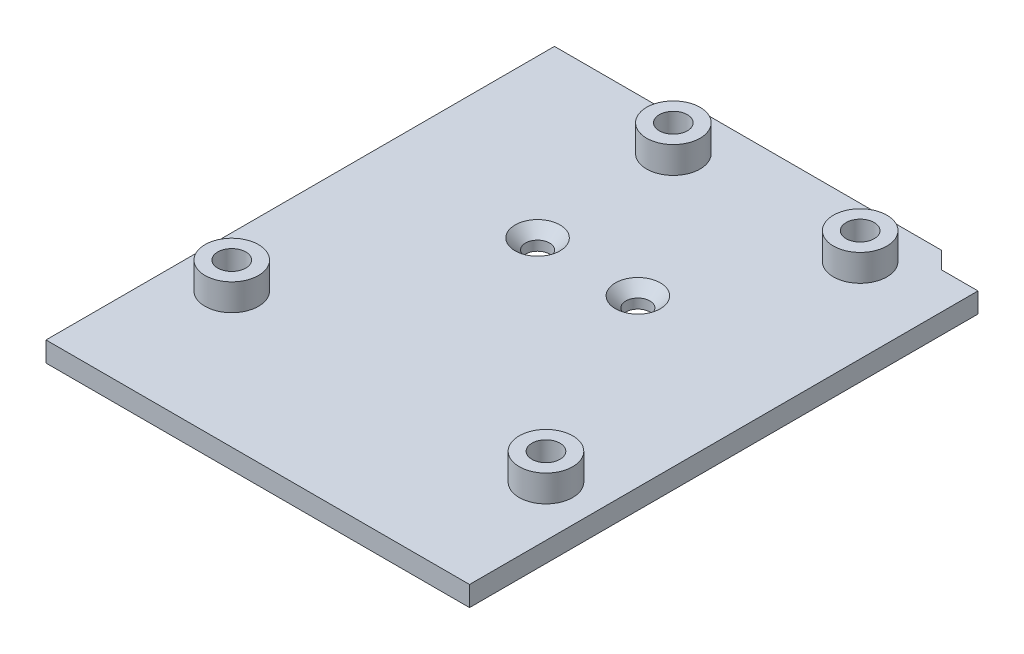
ISO-10303-21;
HEADER;
FILE_DESCRIPTION(('STEP AP214'),'2;1');
FILE_NAME('part.step','',(''),(''),'','','');
FILE_SCHEMA(('AUTOMOTIVE_DESIGN { 1 0 10303 214 1 1 1 1 }'));
ENDSEC;
DATA;
#1=APPLICATION_CONTEXT('core data for automotive mechanical design processes');
#2=APPLICATION_PROTOCOL_DEFINITION('international standard','automotive_design',2000,#1);
#3=PRODUCT_CONTEXT('',#1,'mechanical');
#4=PRODUCT('Part','Part','',(#3));
#5=PRODUCT_RELATED_PRODUCT_CATEGORY('part','',(#4));
#6=PRODUCT_DEFINITION_FORMATION('','',#4);
#7=PRODUCT_DEFINITION_CONTEXT('part definition',#1,'design');
#8=PRODUCT_DEFINITION('design','',#6,#7);
#9=PRODUCT_DEFINITION_SHAPE('','',#8);
#10=(LENGTH_UNIT() NAMED_UNIT(*) SI_UNIT(.MILLI.,.METRE.));
#11=(NAMED_UNIT(*) PLANE_ANGLE_UNIT() SI_UNIT($,.RADIAN.));
#12=(NAMED_UNIT(*) SI_UNIT($,.STERADIAN.) SOLID_ANGLE_UNIT());
#13=UNCERTAINTY_MEASURE_WITH_UNIT(LENGTH_MEASURE(1.E-05),#10,'distance_accuracy_value','');
#14=(GEOMETRIC_REPRESENTATION_CONTEXT(3) GLOBAL_UNCERTAINTY_ASSIGNED_CONTEXT((#13)) GLOBAL_UNIT_ASSIGNED_CONTEXT((#10,
#11,#12)) REPRESENTATION_CONTEXT('',''));
#15=CARTESIAN_POINT('',(0.,0.,0.));
#16=DIRECTION('',(0.,0.,1.));
#17=DIRECTION('',(1.,0.,0.));
#18=AXIS2_PLACEMENT_3D('',#15,#16,#17);
#19=CARTESIAN_POINT('',(0.,3.,0.));
#20=DIRECTION('',(0.,1.,0.));
#21=DIRECTION('',(0.,0.,1.));
#22=AXIS2_PLACEMENT_3D('',#19,#20,#21);
#23=PLANE('',#22);
#24=CARTESIAN_POINT('',(-34.7977808411741,3.,-44.9735412165921));
#25=DIRECTION('',(0.,1.,0.));
#26=DIRECTION('',(0.,0.,1.));
#27=AXIS2_PLACEMENT_3D('',#24,#25,#26);
#28=CIRCLE('',#27,3.36);
#29=CARTESIAN_POINT('',(-34.7977808411741,3.,-41.6135412165921));
#30=VERTEX_POINT('',#29);
#31=EDGE_CURVE('E328',#30,#30,#28,.T.);
#32=ORIENTED_EDGE('',*,*,#31,.F.);
#33=EDGE_LOOP('',(#32));
#34=FACE_BOUND('',#33,.T.);
#35=CARTESIAN_POINT('',(-19.7977808411741,3.,-44.9735412165921));
#36=DIRECTION('',(0.,1.,0.));
#37=DIRECTION('',(0.,0.,1.));
#38=AXIS2_PLACEMENT_3D('',#35,#36,#37);
#39=CIRCLE('',#38,3.36);
#40=CARTESIAN_POINT('',(-19.7977808411741,3.,-41.6135412165921));
#41=VERTEX_POINT('',#40);
#42=EDGE_CURVE('E168',#41,#41,#39,.T.);
#43=ORIENTED_EDGE('',*,*,#42,.F.);
#44=EDGE_LOOP('',(#43));
#45=FACE_BOUND('',#44,.T.);
#46=CARTESIAN_POINT('',(-7.62,3.,-66.04));
#47=DIRECTION('',(0.,1.,0.));
#48=DIRECTION('',(0.,0.,1.));
#49=AXIS2_PLACEMENT_3D('',#46,#47,#48);
#50=CIRCLE('',#49,4.);
#51=CARTESIAN_POINT('',(-7.62,3.,-62.04));
#52=VERTEX_POINT('',#51);
#53=EDGE_CURVE('E184',#52,#52,#50,.T.);
#54=ORIENTED_EDGE('',*,*,#53,.F.);
#55=EDGE_LOOP('',(#54));
#56=FACE_BOUND('',#55,.T.);
#57=CARTESIAN_POINT('',(-50.8,3.,-15.24));
#58=DIRECTION('',(0.,1.,0.));
#59=DIRECTION('',(0.,0.,1.));
#60=AXIS2_PLACEMENT_3D('',#57,#58,#59);
#61=CIRCLE('',#60,4.00000000000001);
#62=CARTESIAN_POINT('',(-50.8,3.,-11.24));
#63=VERTEX_POINT('',#62);
#64=EDGE_CURVE('E202',#63,#63,#61,.T.);
#65=ORIENTED_EDGE('',*,*,#64,.F.);
#66=EDGE_LOOP('',(#65));
#67=FACE_BOUND('',#66,.T.);
#68=DIRECTION('',(1.,0.,0.));
#69=VECTOR('',#68,1.);
#70=CARTESIAN_POINT('',(-58.34,3.,5.00000000000001));
#71=LINE('',#70,#69);
#72=CARTESIAN_POINT('',(-58.34,3.,5.00000000000001));
#73=VERTEX_POINT('',#72);
#74=CARTESIAN_POINT('',(5.,3.,5.00000000000001));
#75=VERTEX_POINT('',#74);
#76=EDGE_CURVE('E147',#73,#75,#71,.T.);
#77=ORIENTED_EDGE('',*,*,#76,.T.);
#78=DIRECTION('',(0.,0.,-1.));
#79=VECTOR('',#78,1.);
#80=CARTESIAN_POINT('',(5.,3.,5.00000000000001));
#81=LINE('',#80,#79);
#82=CARTESIAN_POINT('',(5.,3.,-71.04));
#83=VERTEX_POINT('',#82);
#84=EDGE_CURVE('E95',#75,#83,#81,.T.);
#85=ORIENTED_EDGE('',*,*,#84,.T.);
#86=DIRECTION('',(-1.,0.,0.));
#87=VECTOR('',#86,1.);
#88=CARTESIAN_POINT('',(5.,3.,-71.04));
#89=LINE('',#88,#87);
#90=CARTESIAN_POINT('',(-0.468932188134528,3.,-71.04));
#91=VERTEX_POINT('',#90);
#92=EDGE_CURVE('E221',#83,#91,#89,.T.);
#93=ORIENTED_EDGE('',*,*,#92,.T.);
#94=DIRECTION('',(-0.707106781186548,0.,-0.707106781186547));
#95=VECTOR('',#94,1.);
#96=CARTESIAN_POINT('',(-0.468932188134528,3.,-71.04));
#97=LINE('',#96,#95);
#98=CARTESIAN_POINT('',(-3.00893218813453,3.,-73.58));
#99=VERTEX_POINT('',#98);
#100=EDGE_CURVE('E223',#91,#99,#97,.T.);
#101=ORIENTED_EDGE('',*,*,#100,.T.);
#102=DIRECTION('',(-1.,0.,0.));
#103=VECTOR('',#102,1.);
#104=CARTESIAN_POINT('',(-3.00893218813453,3.,-73.58));
#105=LINE('',#104,#103);
#106=CARTESIAN_POINT('',(-39.9170678118655,3.,-73.58));
#107=VERTEX_POINT('',#106);
#108=EDGE_CURVE('E114',#99,#107,#105,.T.);
#109=ORIENTED_EDGE('',*,*,#108,.T.);
#110=DIRECTION('',(-0.707106781186548,0.,0.707106781186548));
#111=VECTOR('',#110,1.);
#112=CARTESIAN_POINT('',(-39.9170678118655,3.,-73.58));
#113=LINE('',#112,#111);
#114=CARTESIAN_POINT('',(-42.4570678118655,3.,-71.04));
#115=VERTEX_POINT('',#114);
#116=EDGE_CURVE('E108',#107,#115,#113,.T.);
#117=ORIENTED_EDGE('',*,*,#116,.T.);
#118=DIRECTION('',(-1.,0.,0.));
#119=VECTOR('',#118,1.);
#120=CARTESIAN_POINT('',(-42.4570678118655,3.,-71.04));
#121=LINE('',#120,#119);
#122=CARTESIAN_POINT('',(-58.34,3.,-71.04));
#123=VERTEX_POINT('',#122);
#124=EDGE_CURVE('E112',#115,#123,#121,.T.);
#125=ORIENTED_EDGE('',*,*,#124,.T.);
#126=DIRECTION('',(0.,0.,1.));
#127=VECTOR('',#126,1.);
#128=CARTESIAN_POINT('',(-58.34,3.,-71.04));
#129=LINE('',#128,#127);
#130=EDGE_CURVE('E52',#123,#73,#129,.T.);
#131=ORIENTED_EDGE('',*,*,#130,.T.);
#132=EDGE_LOOP('',(#77,#85,#93,#101,#109,#117,#125,#131));
#133=FACE_BOUND('',#132,.T.);
#134=CARTESIAN_POINT('',(-35.56,3.,-66.04));
#135=DIRECTION('',(0.,1.,0.));
#136=DIRECTION('',(0.,0.,1.));
#137=AXIS2_PLACEMENT_3D('',#134,#135,#136);
#138=CIRCLE('',#137,4.);
#139=CARTESIAN_POINT('',(-35.56,3.,-62.04));
#140=VERTEX_POINT('',#139);
#141=EDGE_CURVE('E193',#140,#140,#138,.T.);
#142=ORIENTED_EDGE('',*,*,#141,.F.);
#143=EDGE_LOOP('',(#142));
#144=FACE_BOUND('',#143,.T.);
#145=CARTESIAN_POINT('',(-2.54,3.,-13.97));
#146=DIRECTION('',(0.,1.,0.));
#147=DIRECTION('',(0.,0.,1.));
#148=AXIS2_PLACEMENT_3D('',#145,#146,#147);
#149=CIRCLE('',#148,4.);
#150=CARTESIAN_POINT('',(-2.54,3.,-9.97));
#151=VERTEX_POINT('',#150);
#152=EDGE_CURVE('E165',#151,#151,#149,.T.);
#153=ORIENTED_EDGE('',*,*,#152,.F.);
#154=EDGE_LOOP('',(#153));
#155=FACE_BOUND('',#154,.T.);
#156=ADVANCED_FACE('F33',(#34,#45,#56,#67,#133,#144,#155),#23,.T.);
#157=CARTESIAN_POINT('',(0.,0.,0.));
#158=DIRECTION('',(0.,1.,0.));
#159=DIRECTION('',(0.,0.,1.));
#160=AXIS2_PLACEMENT_3D('',#157,#158,#159);
#161=PLANE('',#160);
#162=CARTESIAN_POINT('',(-34.7977808411741,0.,-44.9735412165921));
#163=DIRECTION('',(0.,1.,0.));
#164=DIRECTION('',(0.,0.,1.));
#165=AXIS2_PLACEMENT_3D('',#162,#163,#164);
#166=CIRCLE('',#165,1.79999999999999);
#167=CARTESIAN_POINT('',(-34.7977808411741,0.,-43.1735412165921));
#168=VERTEX_POINT('',#167);
#169=EDGE_CURVE('E37',#168,#168,#166,.T.);
#170=ORIENTED_EDGE('',*,*,#169,.T.);
#171=EDGE_LOOP('',(#170));
#172=FACE_BOUND('',#171,.T.);
#173=CARTESIAN_POINT('',(-19.7977808411741,0.,-44.9735412165921));
#174=DIRECTION('',(0.,1.,0.));
#175=DIRECTION('',(0.,0.,1.));
#176=AXIS2_PLACEMENT_3D('',#173,#174,#175);
#177=CIRCLE('',#176,1.79999999999999);
#178=CARTESIAN_POINT('',(-19.7977808411741,0.,-43.1735412165921));
#179=VERTEX_POINT('',#178);
#180=EDGE_CURVE('E158',#179,#179,#177,.T.);
#181=ORIENTED_EDGE('',*,*,#180,.T.);
#182=EDGE_LOOP('',(#181));
#183=FACE_BOUND('',#182,.T.);
#184=CARTESIAN_POINT('',(-50.8,0.,-15.24));
#185=DIRECTION('',(0.,1.,0.));
#186=DIRECTION('',(0.,0.,1.));
#187=AXIS2_PLACEMENT_3D('',#184,#185,#186);
#188=CIRCLE('',#187,2.1);
#189=CARTESIAN_POINT('',(-50.8,0.,-13.14));
#190=VERTEX_POINT('',#189);
#191=EDGE_CURVE('E136',#190,#190,#188,.T.);
#192=ORIENTED_EDGE('',*,*,#191,.T.);
#193=EDGE_LOOP('',(#192));
#194=FACE_BOUND('',#193,.T.);
#195=CARTESIAN_POINT('',(-35.56,0.,-66.04));
#196=DIRECTION('',(0.,1.,0.));
#197=DIRECTION('',(0.,0.,1.));
#198=AXIS2_PLACEMENT_3D('',#195,#196,#197);
#199=CIRCLE('',#198,2.1);
#200=CARTESIAN_POINT('',(-35.56,0.,-63.94));
#201=VERTEX_POINT('',#200);
#202=EDGE_CURVE('E211',#201,#201,#199,.T.);
#203=ORIENTED_EDGE('',*,*,#202,.T.);
#204=EDGE_LOOP('',(#203));
#205=FACE_BOUND('',#204,.T.);
#206=CARTESIAN_POINT('',(-7.62,0.,-66.04));
#207=DIRECTION('',(0.,1.,0.));
#208=DIRECTION('',(0.,0.,1.));
#209=AXIS2_PLACEMENT_3D('',#206,#207,#208);
#210=CIRCLE('',#209,2.1);
#211=CARTESIAN_POINT('',(-7.62,0.,-63.94));
#212=VERTEX_POINT('',#211);
#213=EDGE_CURVE('E214',#212,#212,#210,.T.);
#214=ORIENTED_EDGE('',*,*,#213,.T.);
#215=EDGE_LOOP('',(#214));
#216=FACE_BOUND('',#215,.T.);
#217=CARTESIAN_POINT('',(-2.54,0.,-13.97));
#218=DIRECTION('',(0.,1.,0.));
#219=DIRECTION('',(0.,0.,1.));
#220=AXIS2_PLACEMENT_3D('',#217,#218,#219);
#221=CIRCLE('',#220,2.1);
#222=CARTESIAN_POINT('',(-2.54,0.,-11.87));
#223=VERTEX_POINT('',#222);
#224=EDGE_CURVE('E206',#223,#223,#221,.T.);
#225=ORIENTED_EDGE('',*,*,#224,.T.);
#226=EDGE_LOOP('',(#225));
#227=FACE_BOUND('',#226,.T.);
#228=DIRECTION('',(1.,0.,0.));
#229=VECTOR('',#228,1.);
#230=CARTESIAN_POINT('',(-58.34,0.,5.00000000000001));
#231=LINE('',#230,#229);
#232=CARTESIAN_POINT('',(-58.34,0.,5.00000000000001));
#233=VERTEX_POINT('',#232);
#234=CARTESIAN_POINT('',(5.,0.,5.00000000000001));
#235=VERTEX_POINT('',#234);
#236=EDGE_CURVE('E132',#233,#235,#231,.T.);
#237=ORIENTED_EDGE('',*,*,#236,.F.);
#238=DIRECTION('',(0.,0.,1.));
#239=VECTOR('',#238,1.);
#240=CARTESIAN_POINT('',(-58.34,0.,-71.04));
#241=LINE('',#240,#239);
#242=CARTESIAN_POINT('',(-58.34,0.,-71.04));
#243=VERTEX_POINT('',#242);
#244=EDGE_CURVE('E87',#243,#233,#241,.T.);
#245=ORIENTED_EDGE('',*,*,#244,.F.);
#246=DIRECTION('',(-1.,0.,0.));
#247=VECTOR('',#246,1.);
#248=CARTESIAN_POINT('',(-42.4570678118655,0.,-71.04));
#249=LINE('',#248,#247);
#250=CARTESIAN_POINT('',(-42.4570678118655,0.,-71.04));
#251=VERTEX_POINT('',#250);
#252=EDGE_CURVE('E81',#251,#243,#249,.T.);
#253=ORIENTED_EDGE('',*,*,#252,.F.);
#254=DIRECTION('',(-0.707106781186548,0.,0.707106781186548));
#255=VECTOR('',#254,1.);
#256=CARTESIAN_POINT('',(-39.9170678118655,0.,-73.58));
#257=LINE('',#256,#255);
#258=CARTESIAN_POINT('',(-39.9170678118655,0.,-73.58));
#259=VERTEX_POINT('',#258);
#260=EDGE_CURVE('E122',#259,#251,#257,.T.);
#261=ORIENTED_EDGE('',*,*,#260,.F.);
#262=DIRECTION('',(-1.,0.,0.));
#263=VECTOR('',#262,1.);
#264=CARTESIAN_POINT('',(-3.00893218813453,0.,-73.58));
#265=LINE('',#264,#263);
#266=CARTESIAN_POINT('',(-3.00893218813453,0.,-73.58));
#267=VERTEX_POINT('',#266);
#268=EDGE_CURVE('E142',#267,#259,#265,.T.);
#269=ORIENTED_EDGE('',*,*,#268,.F.);
#270=DIRECTION('',(-0.707106781186548,0.,-0.707106781186547));
#271=VECTOR('',#270,1.);
#272=CARTESIAN_POINT('',(-0.468932188134528,0.,-71.04));
#273=LINE('',#272,#271);
#274=CARTESIAN_POINT('',(-0.468932188134528,0.,-71.04));
#275=VERTEX_POINT('',#274);
#276=EDGE_CURVE('E140',#275,#267,#273,.T.);
#277=ORIENTED_EDGE('',*,*,#276,.F.);
#278=DIRECTION('',(-1.,0.,0.));
#279=VECTOR('',#278,1.);
#280=CARTESIAN_POINT('',(5.,0.,-71.04));
#281=LINE('',#280,#279);
#282=CARTESIAN_POINT('',(5.,0.,-71.04));
#283=VERTEX_POINT('',#282);
#284=EDGE_CURVE('E138',#283,#275,#281,.T.);
#285=ORIENTED_EDGE('',*,*,#284,.F.);
#286=DIRECTION('',(0.,0.,-1.));
#287=VECTOR('',#286,1.);
#288=CARTESIAN_POINT('',(5.,0.,5.00000000000001));
#289=LINE('',#288,#287);
#290=EDGE_CURVE('E135',#235,#283,#289,.T.);
#291=ORIENTED_EDGE('',*,*,#290,.F.);
#292=EDGE_LOOP('',(#237,#245,#253,#261,#269,#277,#285,#291));
#293=FACE_BOUND('',#292,.T.);
#294=ADVANCED_FACE('F236',(#172,#183,#194,#205,#216,#227,#293),#161,.F.);
#295=CARTESIAN_POINT('',(-58.34,3.,5.00000000000001));
#296=DIRECTION('',(0.,0.,-1.));
#297=DIRECTION('',(-1.,0.,0.));
#298=AXIS2_PLACEMENT_3D('',#295,#296,#297);
#299=PLANE('',#298);
#300=ORIENTED_EDGE('',*,*,#236,.T.);
#301=DIRECTION('',(0.,-1.,0.));
#302=VECTOR('',#301,1.);
#303=CARTESIAN_POINT('',(5.,3.,5.00000000000001));
#304=LINE('',#303,#302);
#305=EDGE_CURVE('E11',#75,#235,#304,.T.);
#306=ORIENTED_EDGE('',*,*,#305,.F.);
#307=ORIENTED_EDGE('',*,*,#76,.F.);
#308=DIRECTION('',(0.,-1.,0.));
#309=VECTOR('',#308,1.);
#310=CARTESIAN_POINT('',(-58.34,3.,5.00000000000001));
#311=LINE('',#310,#309);
#312=EDGE_CURVE('E128',#73,#233,#311,.T.);
#313=ORIENTED_EDGE('',*,*,#312,.T.);
#314=EDGE_LOOP('',(#300,#306,#307,#313));
#315=FACE_BOUND('',#314,.T.);
#316=ADVANCED_FACE('F35',(#315),#299,.F.);
#317=CARTESIAN_POINT('',(5.,3.,5.00000000000001));
#318=DIRECTION('',(-1.,0.,0.));
#319=DIRECTION('',(0.,0.,1.));
#320=AXIS2_PLACEMENT_3D('',#317,#318,#319);
#321=PLANE('',#320);
#322=ORIENTED_EDGE('',*,*,#290,.T.);
#323=DIRECTION('',(0.,-1.,0.));
#324=VECTOR('',#323,1.);
#325=CARTESIAN_POINT('',(5.,3.,-71.04));
#326=LINE('',#325,#324);
#327=EDGE_CURVE('E43',#83,#283,#326,.T.);
#328=ORIENTED_EDGE('',*,*,#327,.F.);
#329=ORIENTED_EDGE('',*,*,#84,.F.);
#330=ORIENTED_EDGE('',*,*,#305,.T.);
#331=EDGE_LOOP('',(#322,#328,#329,#330));
#332=FACE_BOUND('',#331,.T.);
#333=ADVANCED_FACE('F460',(#332),#321,.F.);
#334=CARTESIAN_POINT('',(5.,3.,-71.04));
#335=DIRECTION('',(0.,0.,1.));
#336=DIRECTION('',(1.,0.,0.));
#337=AXIS2_PLACEMENT_3D('',#334,#335,#336);
#338=PLANE('',#337);
#339=ORIENTED_EDGE('',*,*,#284,.T.);
#340=DIRECTION('',(0.,-1.,0.));
#341=VECTOR('',#340,1.);
#342=CARTESIAN_POINT('',(-0.468932188134528,3.,-71.04));
#343=LINE('',#342,#341);
#344=EDGE_CURVE('E154',#91,#275,#343,.T.);
#345=ORIENTED_EDGE('',*,*,#344,.F.);
#346=ORIENTED_EDGE('',*,*,#92,.F.);
#347=ORIENTED_EDGE('',*,*,#327,.T.);
#348=EDGE_LOOP('',(#339,#345,#346,#347));
#349=FACE_BOUND('',#348,.T.);
#350=ADVANCED_FACE('F451',(#349),#338,.F.);
#351=CARTESIAN_POINT('',(-0.468932188134528,3.,-71.04));
#352=DIRECTION('',(-0.707106781186547,0.,0.707106781186548));
#353=DIRECTION('',(0.707106781186548,0.,0.707106781186547));
#354=AXIS2_PLACEMENT_3D('',#351,#352,#353);
#355=PLANE('',#354);
#356=ORIENTED_EDGE('',*,*,#276,.T.);
#357=DIRECTION('',(0.,-1.,0.));
#358=VECTOR('',#357,1.);
#359=CARTESIAN_POINT('',(-3.00893218813453,3.,-73.58));
#360=LINE('',#359,#358);
#361=EDGE_CURVE('E151',#99,#267,#360,.T.);
#362=ORIENTED_EDGE('',*,*,#361,.F.);
#363=ORIENTED_EDGE('',*,*,#100,.F.);
#364=ORIENTED_EDGE('',*,*,#344,.T.);
#365=EDGE_LOOP('',(#356,#362,#363,#364));
#366=FACE_BOUND('',#365,.T.);
#367=ADVANCED_FACE('F229',(#366),#355,.F.);
#368=CARTESIAN_POINT('',(-3.00893218813453,3.,-73.58));
#369=DIRECTION('',(0.,0.,1.));
#370=DIRECTION('',(1.,0.,0.));
#371=AXIS2_PLACEMENT_3D('',#368,#369,#370);
#372=PLANE('',#371);
#373=ORIENTED_EDGE('',*,*,#268,.T.);
#374=DIRECTION('',(0.,-1.,0.));
#375=VECTOR('',#374,1.);
#376=CARTESIAN_POINT('',(-39.9170678118655,3.,-73.58));
#377=LINE('',#376,#375);
#378=EDGE_CURVE('E123',#107,#259,#377,.T.);
#379=ORIENTED_EDGE('',*,*,#378,.F.);
#380=ORIENTED_EDGE('',*,*,#108,.F.);
#381=ORIENTED_EDGE('',*,*,#361,.T.);
#382=EDGE_LOOP('',(#373,#379,#380,#381));
#383=FACE_BOUND('',#382,.T.);
#384=ADVANCED_FACE('F233',(#383),#372,.F.);
#385=CARTESIAN_POINT('',(-39.9170678118655,3.,-73.58));
#386=DIRECTION('',(0.707106781186547,0.,0.707106781186547));
#387=DIRECTION('',(0.707106781186548,0.,-0.707106781186548));
#388=AXIS2_PLACEMENT_3D('',#385,#386,#387);
#389=PLANE('',#388);
#390=ORIENTED_EDGE('',*,*,#260,.T.);
#391=DIRECTION('',(0.,-1.,0.));
#392=VECTOR('',#391,1.);
#393=CARTESIAN_POINT('',(-42.4570678118655,3.,-71.04));
#394=LINE('',#393,#392);
#395=EDGE_CURVE('E119',#115,#251,#394,.T.);
#396=ORIENTED_EDGE('',*,*,#395,.F.);
#397=ORIENTED_EDGE('',*,*,#116,.F.);
#398=ORIENTED_EDGE('',*,*,#378,.T.);
#399=EDGE_LOOP('',(#390,#396,#397,#398));
#400=FACE_BOUND('',#399,.T.);
#401=ADVANCED_FACE('F120',(#400),#389,.F.);
#402=CARTESIAN_POINT('',(-42.4570678118655,3.,-71.04));
#403=DIRECTION('',(0.,0.,1.));
#404=DIRECTION('',(1.,0.,0.));
#405=AXIS2_PLACEMENT_3D('',#402,#403,#404);
#406=PLANE('',#405);
#407=ORIENTED_EDGE('',*,*,#252,.T.);
#408=DIRECTION('',(0.,-1.,0.));
#409=VECTOR('',#408,1.);
#410=CARTESIAN_POINT('',(-58.34,3.,-71.04));
#411=LINE('',#410,#409);
#412=EDGE_CURVE('E124',#123,#243,#411,.T.);
#413=ORIENTED_EDGE('',*,*,#412,.F.);
#414=ORIENTED_EDGE('',*,*,#124,.F.);
#415=ORIENTED_EDGE('',*,*,#395,.T.);
#416=EDGE_LOOP('',(#407,#413,#414,#415));
#417=FACE_BOUND('',#416,.T.);
#418=ADVANCED_FACE('F126',(#417),#406,.F.);
#419=CARTESIAN_POINT('',(-58.34,3.,-71.04));
#420=DIRECTION('',(1.,0.,0.));
#421=DIRECTION('',(0.,0.,-1.));
#422=AXIS2_PLACEMENT_3D('',#419,#420,#421);
#423=PLANE('',#422);
#424=ORIENTED_EDGE('',*,*,#244,.T.);
#425=ORIENTED_EDGE('',*,*,#312,.F.);
#426=ORIENTED_EDGE('',*,*,#130,.F.);
#427=ORIENTED_EDGE('',*,*,#412,.T.);
#428=EDGE_LOOP('',(#424,#425,#426,#427));
#429=FACE_BOUND('',#428,.T.);
#430=ADVANCED_FACE('F241',(#429),#423,.F.);
#431=CARTESIAN_POINT('',(-2.54,0.,-13.97));
#432=DIRECTION('',(0.,1.,0.));
#433=DIRECTION('',(0.,0.,1.));
#434=AXIS2_PLACEMENT_3D('',#431,#432,#433);
#435=CYLINDRICAL_SURFACE('',#434,2.1);
#436=ORIENTED_EDGE('',*,*,#224,.F.);
#437=EDGE_LOOP('',(#436));
#438=FACE_BOUND('',#437,.T.);
#439=CARTESIAN_POINT('',(-2.54,7.,-13.97));
#440=DIRECTION('',(0.,1.,0.));
#441=DIRECTION('',(0.,0.,1.));
#442=AXIS2_PLACEMENT_3D('',#439,#440,#441);
#443=CIRCLE('',#442,2.1);
#444=CARTESIAN_POINT('',(-2.54,7.,-11.87));
#445=VERTEX_POINT('',#444);
#446=EDGE_CURVE('E160',#445,#445,#443,.T.);
#447=ORIENTED_EDGE('',*,*,#446,.T.);
#448=EDGE_LOOP('',(#447));
#449=FACE_BOUND('',#448,.T.);
#450=ADVANCED_FACE('F243',(#438,#449),#435,.F.);
#451=CARTESIAN_POINT('',(-7.62,0.,-66.04));
#452=DIRECTION('',(0.,1.,0.));
#453=DIRECTION('',(0.,0.,1.));
#454=AXIS2_PLACEMENT_3D('',#451,#452,#453);
#455=CYLINDRICAL_SURFACE('',#454,2.1);
#456=ORIENTED_EDGE('',*,*,#213,.F.);
#457=EDGE_LOOP('',(#456));
#458=FACE_BOUND('',#457,.T.);
#459=CARTESIAN_POINT('',(-7.62,7.,-66.04));
#460=DIRECTION('',(0.,1.,0.));
#461=DIRECTION('',(0.,0.,1.));
#462=AXIS2_PLACEMENT_3D('',#459,#460,#461);
#463=CIRCLE('',#462,2.10000000000001);
#464=CARTESIAN_POINT('',(-7.62,7.,-63.94));
#465=VERTEX_POINT('',#464);
#466=EDGE_CURVE('E179',#465,#465,#463,.T.);
#467=ORIENTED_EDGE('',*,*,#466,.T.);
#468=EDGE_LOOP('',(#467));
#469=FACE_BOUND('',#468,.T.);
#470=ADVANCED_FACE('F249',(#458,#469),#455,.F.);
#471=CARTESIAN_POINT('',(-35.56,0.,-66.04));
#472=DIRECTION('',(0.,1.,0.));
#473=DIRECTION('',(0.,0.,1.));
#474=AXIS2_PLACEMENT_3D('',#471,#472,#473);
#475=CYLINDRICAL_SURFACE('',#474,2.1);
#476=ORIENTED_EDGE('',*,*,#202,.F.);
#477=EDGE_LOOP('',(#476));
#478=FACE_BOUND('',#477,.T.);
#479=CARTESIAN_POINT('',(-35.56,7.,-66.04));
#480=DIRECTION('',(0.,1.,0.));
#481=DIRECTION('',(0.,0.,1.));
#482=AXIS2_PLACEMENT_3D('',#479,#480,#481);
#483=CIRCLE('',#482,2.1);
#484=CARTESIAN_POINT('',(-35.56,7.,-63.94));
#485=VERTEX_POINT('',#484);
#486=EDGE_CURVE('E188',#485,#485,#483,.T.);
#487=ORIENTED_EDGE('',*,*,#486,.T.);
#488=EDGE_LOOP('',(#487));
#489=FACE_BOUND('',#488,.T.);
#490=ADVANCED_FACE('F266',(#478,#489),#475,.F.);
#491=CARTESIAN_POINT('',(-50.8,0.,-15.24));
#492=DIRECTION('',(0.,1.,0.));
#493=DIRECTION('',(0.,0.,1.));
#494=AXIS2_PLACEMENT_3D('',#491,#492,#493);
#495=CYLINDRICAL_SURFACE('',#494,2.1);
#496=ORIENTED_EDGE('',*,*,#191,.F.);
#497=EDGE_LOOP('',(#496));
#498=FACE_BOUND('',#497,.T.);
#499=CARTESIAN_POINT('',(-50.8,7.,-15.24));
#500=DIRECTION('',(0.,1.,0.));
#501=DIRECTION('',(0.,0.,1.));
#502=AXIS2_PLACEMENT_3D('',#499,#500,#501);
#503=CIRCLE('',#502,2.1);
#504=CARTESIAN_POINT('',(-50.8,7.,-13.14));
#505=VERTEX_POINT('',#504);
#506=EDGE_CURVE('E197',#505,#505,#503,.T.);
#507=ORIENTED_EDGE('',*,*,#506,.T.);
#508=EDGE_LOOP('',(#507));
#509=FACE_BOUND('',#508,.T.);
#510=ADVANCED_FACE('F270',(#498,#509),#495,.F.);
#511=CARTESIAN_POINT('',(-50.8,7.,-15.24));
#512=DIRECTION('',(0.,1.,0.));
#513=DIRECTION('',(0.,0.,1.));
#514=AXIS2_PLACEMENT_3D('',#511,#512,#513);
#515=PLANE('',#514);
#516=CARTESIAN_POINT('',(-50.8,7.,-15.24));
#517=DIRECTION('',(0.,1.,0.));
#518=DIRECTION('',(0.,0.,1.));
#519=AXIS2_PLACEMENT_3D('',#516,#517,#518);
#520=CIRCLE('',#519,4.00000000000001);
#521=CARTESIAN_POINT('',(-50.8,7.,-11.24));
#522=VERTEX_POINT('',#521);
#523=EDGE_CURVE('E203',#522,#522,#520,.T.);
#524=ORIENTED_EDGE('',*,*,#523,.T.);
#525=EDGE_LOOP('',(#524));
#526=FACE_BOUND('',#525,.T.);
#527=ORIENTED_EDGE('',*,*,#506,.F.);
#528=EDGE_LOOP('',(#527));
#529=FACE_BOUND('',#528,.T.);
#530=ADVANCED_FACE('F274',(#526,#529),#515,.T.);
#531=CARTESIAN_POINT('',(-50.8,7.,-15.24));
#532=DIRECTION('',(0.,-1.,0.));
#533=DIRECTION('',(0.,0.,-1.));
#534=AXIS2_PLACEMENT_3D('',#531,#532,#533);
#535=CYLINDRICAL_SURFACE('',#534,4.00000000000001);
#536=ORIENTED_EDGE('',*,*,#523,.F.);
#537=EDGE_LOOP('',(#536));
#538=FACE_BOUND('',#537,.T.);
#539=ORIENTED_EDGE('',*,*,#64,.T.);
#540=EDGE_LOOP('',(#539));
#541=FACE_BOUND('',#540,.T.);
#542=ADVANCED_FACE('F276',(#538,#541),#535,.T.);
#543=CARTESIAN_POINT('',(-35.56,7.,-66.04));
#544=DIRECTION('',(0.,1.,0.));
#545=DIRECTION('',(0.,0.,1.));
#546=AXIS2_PLACEMENT_3D('',#543,#544,#545);
#547=PLANE('',#546);
#548=CARTESIAN_POINT('',(-35.56,7.,-66.04));
#549=DIRECTION('',(0.,1.,0.));
#550=DIRECTION('',(0.,0.,1.));
#551=AXIS2_PLACEMENT_3D('',#548,#549,#550);
#552=CIRCLE('',#551,4.);
#553=CARTESIAN_POINT('',(-35.56,7.,-62.04));
#554=VERTEX_POINT('',#553);
#555=EDGE_CURVE('E194',#554,#554,#552,.T.);
#556=ORIENTED_EDGE('',*,*,#555,.T.);
#557=EDGE_LOOP('',(#556));
#558=FACE_BOUND('',#557,.T.);
#559=ORIENTED_EDGE('',*,*,#486,.F.);
#560=EDGE_LOOP('',(#559));
#561=FACE_BOUND('',#560,.T.);
#562=ADVANCED_FACE('F279',(#558,#561),#547,.T.);
#563=CARTESIAN_POINT('',(-35.56,7.,-66.04));
#564=DIRECTION('',(0.,-1.,0.));
#565=DIRECTION('',(0.,0.,-1.));
#566=AXIS2_PLACEMENT_3D('',#563,#564,#565);
#567=CYLINDRICAL_SURFACE('',#566,4.);
#568=ORIENTED_EDGE('',*,*,#555,.F.);
#569=EDGE_LOOP('',(#568));
#570=FACE_BOUND('',#569,.T.);
#571=ORIENTED_EDGE('',*,*,#141,.T.);
#572=EDGE_LOOP('',(#571));
#573=FACE_BOUND('',#572,.T.);
#574=ADVANCED_FACE('F284',(#570,#573),#567,.T.);
#575=CARTESIAN_POINT('',(-7.62,7.,-66.04));
#576=DIRECTION('',(0.,1.,0.));
#577=DIRECTION('',(0.,0.,1.));
#578=AXIS2_PLACEMENT_3D('',#575,#576,#577);
#579=PLANE('',#578);
#580=CARTESIAN_POINT('',(-7.62,7.,-66.04));
#581=DIRECTION('',(0.,1.,0.));
#582=DIRECTION('',(0.,0.,1.));
#583=AXIS2_PLACEMENT_3D('',#580,#581,#582);
#584=CIRCLE('',#583,4.);
#585=CARTESIAN_POINT('',(-7.62,7.,-62.04));
#586=VERTEX_POINT('',#585);
#587=EDGE_CURVE('E185',#586,#586,#584,.T.);
#588=ORIENTED_EDGE('',*,*,#587,.T.);
#589=EDGE_LOOP('',(#588));
#590=FACE_BOUND('',#589,.T.);
#591=ORIENTED_EDGE('',*,*,#466,.F.);
#592=EDGE_LOOP('',(#591));
#593=FACE_BOUND('',#592,.T.);
#594=ADVANCED_FACE('F287',(#590,#593),#579,.T.);
#595=CARTESIAN_POINT('',(-7.62,7.,-66.04));
#596=DIRECTION('',(0.,-1.,0.));
#597=DIRECTION('',(0.,0.,-1.));
#598=AXIS2_PLACEMENT_3D('',#595,#596,#597);
#599=CYLINDRICAL_SURFACE('',#598,4.);
#600=ORIENTED_EDGE('',*,*,#587,.F.);
#601=EDGE_LOOP('',(#600));
#602=FACE_BOUND('',#601,.T.);
#603=ORIENTED_EDGE('',*,*,#53,.T.);
#604=EDGE_LOOP('',(#603));
#605=FACE_BOUND('',#604,.T.);
#606=ADVANCED_FACE('F292',(#602,#605),#599,.T.);
#607=CARTESIAN_POINT('',(-2.54,7.,-13.97));
#608=DIRECTION('',(0.,1.,0.));
#609=DIRECTION('',(0.,0.,1.));
#610=AXIS2_PLACEMENT_3D('',#607,#608,#609);
#611=PLANE('',#610);
#612=CARTESIAN_POINT('',(-2.54,7.,-13.97));
#613=DIRECTION('',(0.,1.,0.));
#614=DIRECTION('',(0.,0.,1.));
#615=AXIS2_PLACEMENT_3D('',#612,#613,#614);
#616=CIRCLE('',#615,4.);
#617=CARTESIAN_POINT('',(-2.54,7.,-9.97));
#618=VERTEX_POINT('',#617);
#619=EDGE_CURVE('E176',#618,#618,#616,.T.);
#620=ORIENTED_EDGE('',*,*,#619,.T.);
#621=EDGE_LOOP('',(#620));
#622=FACE_BOUND('',#621,.T.);
#623=ORIENTED_EDGE('',*,*,#446,.F.);
#624=EDGE_LOOP('',(#623));
#625=FACE_BOUND('',#624,.T.);
#626=ADVANCED_FACE('F295',(#622,#625),#611,.T.);
#627=CARTESIAN_POINT('',(-2.54,7.,-13.97));
#628=DIRECTION('',(0.,-1.,0.));
#629=DIRECTION('',(0.,0.,-1.));
#630=AXIS2_PLACEMENT_3D('',#627,#628,#629);
#631=CYLINDRICAL_SURFACE('',#630,4.);
#632=ORIENTED_EDGE('',*,*,#619,.F.);
#633=EDGE_LOOP('',(#632));
#634=FACE_BOUND('',#633,.T.);
#635=ORIENTED_EDGE('',*,*,#152,.T.);
#636=EDGE_LOOP('',(#635));
#637=FACE_BOUND('',#636,.T.);
#638=ADVANCED_FACE('F300',(#634,#637),#631,.T.);
#639=CARTESIAN_POINT('',(-19.7977808411741,3.,-44.9735412165921));
#640=DIRECTION('',(0.,1.,0.));
#641=DIRECTION('',(0.,0.,1.));
#642=AXIS2_PLACEMENT_3D('',#639,#640,#641);
#643=CYLINDRICAL_SURFACE('',#642,1.79999999999999);
#644=CARTESIAN_POINT('',(-19.7977808411741,1.43999999999998,-44.9735412165921));
#645=DIRECTION('',(0.,1.,0.));
#646=DIRECTION('',(0.,0.,1.));
#647=AXIS2_PLACEMENT_3D('',#644,#645,#646);
#648=CIRCLE('',#647,1.79999999999999);
#649=CARTESIAN_POINT('',(-19.7977808411741,1.43999999999998,-43.1735412165921));
#650=VERTEX_POINT('',#649);
#651=EDGE_CURVE('E161',#650,#650,#648,.T.);
#652=ORIENTED_EDGE('',*,*,#651,.T.);
#653=EDGE_LOOP('',(#652));
#654=FACE_BOUND('',#653,.T.);
#655=ORIENTED_EDGE('',*,*,#180,.F.);
#656=EDGE_LOOP('',(#655));
#657=FACE_BOUND('',#656,.T.);
#658=ADVANCED_FACE('F303',(#654,#657),#643,.F.);
#659=CARTESIAN_POINT('',(-19.7977808411741,3.,-44.9735412165921));
#660=DIRECTION('',(0.,1.,0.));
#661=DIRECTION('',(0.,0.,1.));
#662=AXIS2_PLACEMENT_3D('',#659,#660,#661);
#663=CONICAL_SURFACE('',#662,3.36,0.785398163397446);
#664=ORIENTED_EDGE('',*,*,#651,.F.);
#665=EDGE_LOOP('',(#664));
#666=FACE_BOUND('',#665,.T.);
#667=ORIENTED_EDGE('',*,*,#42,.T.);
#668=EDGE_LOOP('',(#667));
#669=FACE_BOUND('',#668,.T.);
#670=ADVANCED_FACE('F310',(#666,#669),#663,.F.);
#671=CARTESIAN_POINT('',(-34.7977808411741,3.,-44.9735412165921));
#672=DIRECTION('',(0.,1.,0.));
#673=DIRECTION('',(0.,0.,1.));
#674=AXIS2_PLACEMENT_3D('',#671,#672,#673);
#675=CYLINDRICAL_SURFACE('',#674,1.79999999999999);
#676=CARTESIAN_POINT('',(-34.7977808411741,1.43999999999998,-44.9735412165921));
#677=DIRECTION('',(0.,1.,0.));
#678=DIRECTION('',(0.,0.,1.));
#679=AXIS2_PLACEMENT_3D('',#676,#677,#678);
#680=CIRCLE('',#679,1.79999999999999);
#681=CARTESIAN_POINT('',(-34.7977808411741,1.43999999999998,-43.1735412165921));
#682=VERTEX_POINT('',#681);
#683=EDGE_CURVE('E326',#682,#682,#680,.T.);
#684=ORIENTED_EDGE('',*,*,#683,.T.);
#685=EDGE_LOOP('',(#684));
#686=FACE_BOUND('',#685,.T.);
#687=ORIENTED_EDGE('',*,*,#169,.F.);
#688=EDGE_LOOP('',(#687));
#689=FACE_BOUND('',#688,.T.);
#690=ADVANCED_FACE('F313',(#686,#689),#675,.F.);
#691=CARTESIAN_POINT('',(-34.7977808411741,3.,-44.9735412165921));
#692=DIRECTION('',(0.,1.,0.));
#693=DIRECTION('',(0.,0.,1.));
#694=AXIS2_PLACEMENT_3D('',#691,#692,#693);
#695=CONICAL_SURFACE('',#694,3.36,0.785398163397446);
#696=ORIENTED_EDGE('',*,*,#683,.F.);
#697=EDGE_LOOP('',(#696));
#698=FACE_BOUND('',#697,.T.);
#699=ORIENTED_EDGE('',*,*,#31,.T.);
#700=EDGE_LOOP('',(#699));
#701=FACE_BOUND('',#700,.T.);
#702=ADVANCED_FACE('F317',(#698,#701),#695,.F.);
#703=CLOSED_SHELL('',(#156,#294,#316,#333,#350,#367,#384,#401,#418,#430,#450,#470,#490,#510,
#530,#542,#562,#574,#594,#606,#626,#638,#658,#670,#690,#702));
#704=MANIFOLD_SOLID_BREP('B2',#703);
#705=ADVANCED_BREP_SHAPE_REPRESENTATION('',(#18,#704),#14);
#706=SHAPE_DEFINITION_REPRESENTATION(#9,#705);
ENDSEC;
END-ISO-10303-21;
